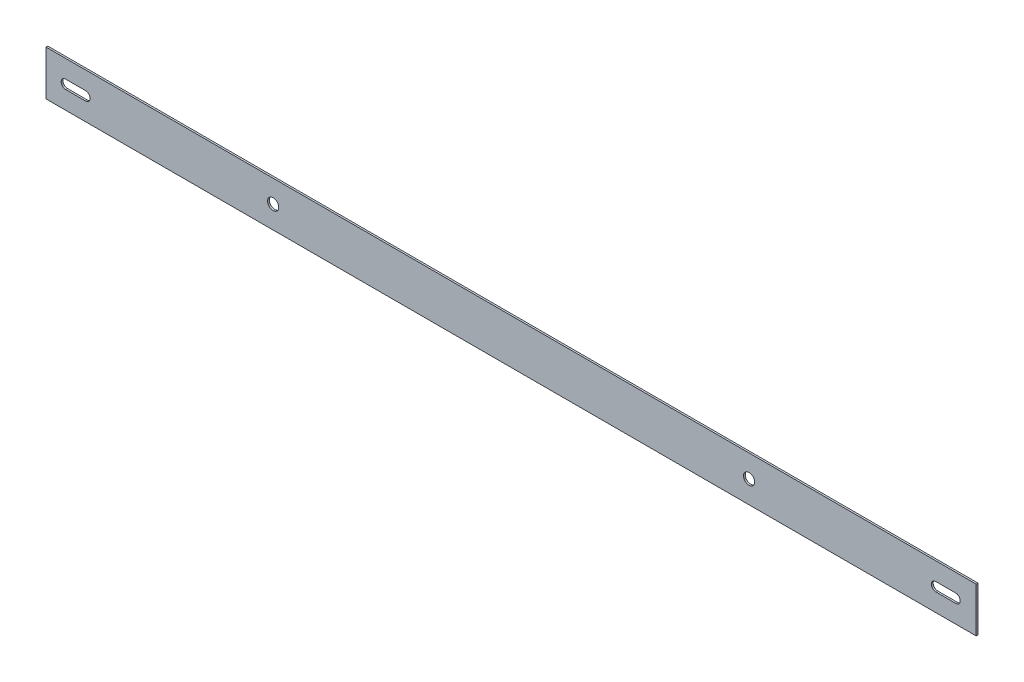
ISO-10303-21;
HEADER;
FILE_DESCRIPTION(('STEP AP214'),'2;1');
FILE_NAME('part.step','',(''),(''),'','','');
FILE_SCHEMA(('AUTOMOTIVE_DESIGN { 1 0 10303 214 1 1 1 1 }'));
ENDSEC;
DATA;
#1=APPLICATION_CONTEXT('core data for automotive mechanical design processes');
#2=APPLICATION_PROTOCOL_DEFINITION('international standard','automotive_design',2000,#1);
#3=PRODUCT_CONTEXT('',#1,'mechanical');
#4=PRODUCT('Part','Part','',(#3));
#5=PRODUCT_RELATED_PRODUCT_CATEGORY('part','',(#4));
#6=PRODUCT_DEFINITION_FORMATION('','',#4);
#7=PRODUCT_DEFINITION_CONTEXT('part definition',#1,'design');
#8=PRODUCT_DEFINITION('design','',#6,#7);
#9=PRODUCT_DEFINITION_SHAPE('','',#8);
#10=(LENGTH_UNIT() NAMED_UNIT(*) SI_UNIT(.MILLI.,.METRE.));
#11=(NAMED_UNIT(*) PLANE_ANGLE_UNIT() SI_UNIT($,.RADIAN.));
#12=(NAMED_UNIT(*) SI_UNIT($,.STERADIAN.) SOLID_ANGLE_UNIT());
#13=UNCERTAINTY_MEASURE_WITH_UNIT(LENGTH_MEASURE(1.E-05),#10,'distance_accuracy_value','');
#14=(GEOMETRIC_REPRESENTATION_CONTEXT(3) GLOBAL_UNCERTAINTY_ASSIGNED_CONTEXT((#13)) GLOBAL_UNIT_ASSIGNED_CONTEXT((#10,
#11,#12)) REPRESENTATION_CONTEXT('',''));
#15=CARTESIAN_POINT('',(0.,0.,0.));
#16=DIRECTION('',(0.,0.,1.));
#17=DIRECTION('',(1.,0.,0.));
#18=AXIS2_PLACEMENT_3D('',#15,#16,#17);
#19=CARTESIAN_POINT('',(-98.,0.,-1.7366));
#20=DIRECTION('',(0.,-1.,0.));
#21=DIRECTION('',(0.,0.,-1.));
#22=AXIS2_PLACEMENT_3D('',#19,#20,#21);
#23=PLANE('',#22);
#24=DIRECTION('',(-1.,0.,0.));
#25=VECTOR('',#24,1.);
#26=CARTESIAN_POINT('',(-99.,0.,0.));
#27=LINE('',#26,#25);
#28=CARTESIAN_POINT('',(258.90399342147,0.,-2.4980018054066E-13));
#29=VERTEX_POINT('',#28);
#30=CARTESIAN_POINT('',(-258.90399342147,0.,-1.38777878078145E-13));
#31=VERTEX_POINT('',#30);
#32=EDGE_CURVE('E71',#29,#31,#27,.T.);
#33=ORIENTED_EDGE('',*,*,#32,.T.);
#34=DIRECTION('',(0.,0.,-1.));
#35=VECTOR('',#34,1.);
#36=CARTESIAN_POINT('',(-258.90399342147,0.,-1.38777878078145E-13));
#37=LINE('',#36,#35);
#38=CARTESIAN_POINT('',(-258.90399342147,0.,-1.00000000000014));
#39=VERTEX_POINT('',#38);
#40=EDGE_CURVE('E265',#31,#39,#37,.T.);
#41=ORIENTED_EDGE('',*,*,#40,.T.);
#42=DIRECTION('',(1.,0.,0.));
#43=VECTOR('',#42,1.);
#44=CARTESIAN_POINT('',(-99.,0.,-1.));
#45=LINE('',#44,#43);
#46=CARTESIAN_POINT('',(258.90399342147,0.,-1.00000000000028));
#47=VERTEX_POINT('',#46);
#48=EDGE_CURVE('E56',#47,#39,#45,.F.);
#49=ORIENTED_EDGE('',*,*,#48,.F.);
#50=DIRECTION('',(0.,0.,1.));
#51=VECTOR('',#50,1.);
#52=CARTESIAN_POINT('',(258.90399342147,0.,-1.00000000000028));
#53=LINE('',#52,#51);
#54=EDGE_CURVE('E221',#47,#29,#53,.T.);
#55=ORIENTED_EDGE('',*,*,#54,.T.);
#56=EDGE_LOOP('',(#33,#41,#49,#55));
#57=FACE_BOUND('',#56,.T.);
#58=ADVANCED_FACE('F52',(#57),#23,.T.);
#59=CARTESIAN_POINT('',(98.,25.,-1.7366));
#60=DIRECTION('',(0.,1.,0.));
#61=DIRECTION('',(0.,0.,1.));
#62=AXIS2_PLACEMENT_3D('',#59,#60,#61);
#63=PLANE('',#62);
#64=DIRECTION('',(-1.,0.,0.));
#65=VECTOR('',#64,1.);
#66=CARTESIAN_POINT('',(-99.,25.,0.));
#67=LINE('',#66,#65);
#68=CARTESIAN_POINT('',(258.90399342147,25.,-2.4980018054066E-13));
#69=VERTEX_POINT('',#68);
#70=CARTESIAN_POINT('',(-258.90399342147,25.,-1.38777878078145E-13));
#71=VERTEX_POINT('',#70);
#72=EDGE_CURVE('E62',#69,#71,#67,.T.);
#73=ORIENTED_EDGE('',*,*,#72,.F.);
#74=DIRECTION('',(0.,0.,1.));
#75=VECTOR('',#74,1.);
#76=CARTESIAN_POINT('',(258.90399342147,25.,-1.00000000000028));
#77=LINE('',#76,#75);
#78=CARTESIAN_POINT('',(258.90399342147,25.,-1.00000000000028));
#79=VERTEX_POINT('',#78);
#80=EDGE_CURVE('E199',#79,#69,#77,.T.);
#81=ORIENTED_EDGE('',*,*,#80,.F.);
#82=DIRECTION('',(1.,0.,0.));
#83=VECTOR('',#82,1.);
#84=CARTESIAN_POINT('',(-99.,25.,-1.));
#85=LINE('',#84,#83);
#86=CARTESIAN_POINT('',(-258.90399342147,25.,-1.00000000000014));
#87=VERTEX_POINT('',#86);
#88=EDGE_CURVE('E13',#79,#87,#85,.F.);
#89=ORIENTED_EDGE('',*,*,#88,.T.);
#90=DIRECTION('',(0.,0.,-1.));
#91=VECTOR('',#90,1.);
#92=CARTESIAN_POINT('',(-258.90399342147,25.,-1.38777878078145E-13));
#93=LINE('',#92,#91);
#94=EDGE_CURVE('E181',#71,#87,#93,.T.);
#95=ORIENTED_EDGE('',*,*,#94,.F.);
#96=EDGE_LOOP('',(#73,#81,#89,#95));
#97=FACE_BOUND('',#96,.T.);
#98=ADVANCED_FACE('F297',(#97),#63,.T.);
#99=CARTESIAN_POINT('',(-99.,25.,0.));
#100=DIRECTION('',(0.,0.,1.));
#101=DIRECTION('',(1.,0.,0.));
#102=AXIS2_PLACEMENT_3D('',#99,#100,#101);
#103=PLANE('',#102);
#104=ORIENTED_EDGE('',*,*,#32,.F.);
#105=DIRECTION('',(0.,-1.,0.));
#106=VECTOR('',#105,1.);
#107=CARTESIAN_POINT('',(258.90399342147,25.,-2.4980018054066E-13));
#108=LINE('',#107,#106);
#109=EDGE_CURVE('E222',#69,#29,#108,.T.);
#110=ORIENTED_EDGE('',*,*,#109,.F.);
#111=ORIENTED_EDGE('',*,*,#72,.T.);
#112=DIRECTION('',(0.,-1.,0.));
#113=VECTOR('',#112,1.);
#114=CARTESIAN_POINT('',(-258.90399342147,25.,-1.38777878078145E-13));
#115=LINE('',#114,#113);
#116=EDGE_CURVE('E245',#71,#31,#115,.T.);
#117=ORIENTED_EDGE('',*,*,#116,.T.);
#118=EDGE_LOOP('',(#104,#110,#111,#117));
#119=FACE_BOUND('',#118,.T.);
#120=CARTESIAN_POINT('',(-247.947003759829,12.5,0.));
#121=DIRECTION('',(0.,0.,1.));
#122=DIRECTION('',(1.,0.,0.));
#123=AXIS2_PLACEMENT_3D('',#120,#121,#122);
#124=CIRCLE('',#123,2.5);
#125=CARTESIAN_POINT('',(-247.947003759829,15.,0.));
#126=VERTEX_POINT('',#125);
#127=CARTESIAN_POINT('',(-247.947003759829,10.,0.));
#128=VERTEX_POINT('',#127);
#129=EDGE_CURVE('E270',#126,#128,#124,.T.);
#130=ORIENTED_EDGE('',*,*,#129,.F.);
#131=DIRECTION('',(1.,0.,0.));
#132=VECTOR('',#131,1.);
#133=CARTESIAN_POINT('',(-242.421237076163,15.,0.));
#134=LINE('',#133,#132);
#135=CARTESIAN_POINT('',(-236.895470392496,15.,0.));
#136=VERTEX_POINT('',#135);
#137=EDGE_CURVE('E588',#136,#126,#134,.F.);
#138=ORIENTED_EDGE('',*,*,#137,.F.);
#139=CARTESIAN_POINT('',(-236.895470392496,12.5,1.2490009027033E-13));
#140=DIRECTION('',(0.,0.,1.));
#141=DIRECTION('',(1.,0.,0.));
#142=AXIS2_PLACEMENT_3D('',#139,#140,#141);
#143=CIRCLE('',#142,2.5);
#144=CARTESIAN_POINT('',(-236.895470392496,10.,1.2490009027033E-13));
#145=VERTEX_POINT('',#144);
#146=EDGE_CURVE('E279',#145,#136,#143,.T.);
#147=ORIENTED_EDGE('',*,*,#146,.F.);
#148=DIRECTION('',(1.,0.,0.));
#149=VECTOR('',#148,1.);
#150=CARTESIAN_POINT('',(-242.421237076163,10.,0.));
#151=LINE('',#150,#149);
#152=EDGE_CURVE('E287',#128,#145,#151,.T.);
#153=ORIENTED_EDGE('',*,*,#152,.F.);
#154=EDGE_LOOP('',(#130,#138,#147,#153));
#155=FACE_BOUND('',#154,.T.);
#156=CARTESIAN_POINT('',(-132.469246737715,12.5,0.));
#157=DIRECTION('',(0.,0.,1.));
#158=DIRECTION('',(1.,0.,0.));
#159=AXIS2_PLACEMENT_3D('',#156,#157,#158);
#160=CIRCLE('',#159,3.1);
#161=CARTESIAN_POINT('',(-129.369246737715,12.5,0.));
#162=VERTEX_POINT('',#161);
#163=EDGE_CURVE('E240',#162,#162,#160,.T.);
#164=ORIENTED_EDGE('',*,*,#163,.F.);
#165=EDGE_LOOP('',(#164));
#166=FACE_BOUND('',#165,.T.);
#167=CARTESIAN_POINT('',(132.469246737715,12.5,0.));
#168=DIRECTION('',(0.,0.,1.));
#169=DIRECTION('',(1.,0.,0.));
#170=AXIS2_PLACEMENT_3D('',#167,#168,#169);
#171=CIRCLE('',#170,3.1);
#172=CARTESIAN_POINT('',(129.369246737715,12.5,0.));
#173=VERTEX_POINT('',#172);
#174=EDGE_CURVE('E182',#173,#173,#171,.T.);
#175=ORIENTED_EDGE('',*,*,#174,.F.);
#176=EDGE_LOOP('',(#175));
#177=FACE_BOUND('',#176,.T.);
#178=DIRECTION('',(1.,0.,0.));
#179=VECTOR('',#178,1.);
#180=CARTESIAN_POINT('',(258.90399342147,9.99999999999999,-2.4980018054066E-13));
#181=LINE('',#180,#179);
#182=CARTESIAN_POINT('',(236.447274908041,10.,0.));
#183=VERTEX_POINT('',#182);
#184=CARTESIAN_POINT('',(247.498876046859,9.99999999999999,0.));
#185=VERTEX_POINT('',#184);
#186=EDGE_CURVE('E194',#183,#185,#181,.T.);
#187=ORIENTED_EDGE('',*,*,#186,.F.);
#188=CARTESIAN_POINT('',(236.447274908041,12.5,0.));
#189=DIRECTION('',(0.,0.,1.));
#190=DIRECTION('',(1.,0.,0.));
#191=AXIS2_PLACEMENT_3D('',#188,#189,#190);
#192=ELLIPSE('',#191,2.50001533078762,2.5);
#193=CARTESIAN_POINT('',(236.447274908041,15.,0.));
#194=VERTEX_POINT('',#193);
#195=EDGE_CURVE('E168',#194,#183,#192,.T.);
#196=ORIENTED_EDGE('',*,*,#195,.F.);
#197=DIRECTION('',(1.,0.,0.));
#198=VECTOR('',#197,1.);
#199=CARTESIAN_POINT('',(258.90399342147,15.,-2.4980018054066E-13));
#200=LINE('',#199,#198);
#201=CARTESIAN_POINT('',(247.498876046859,15.,0.));
#202=VERTEX_POINT('',#201);
#203=EDGE_CURVE('E163',#202,#194,#200,.F.);
#204=ORIENTED_EDGE('',*,*,#203,.F.);
#205=CARTESIAN_POINT('',(247.498876046859,12.5,0.));
#206=DIRECTION('',(0.,0.,1.));
#207=DIRECTION('',(1.,0.,0.));
#208=AXIS2_PLACEMENT_3D('',#205,#206,#207);
#209=ELLIPSE('',#208,2.50001533078761,2.5);
#210=EDGE_CURVE('E152',#185,#202,#209,.T.);
#211=ORIENTED_EDGE('',*,*,#210,.F.);
#212=EDGE_LOOP('',(#187,#196,#204,#211));
#213=FACE_BOUND('',#212,.T.);
#214=ADVANCED_FACE('F54',(#119,#155,#166,#177,#213),#103,.T.);
#215=CARTESIAN_POINT('',(-99.,25.,-1.));
#216=DIRECTION('',(0.,0.,1.));
#217=DIRECTION('',(1.,0.,0.));
#218=AXIS2_PLACEMENT_3D('',#215,#216,#217);
#219=PLANE('',#218);
#220=ORIENTED_EDGE('',*,*,#48,.T.);
#221=DIRECTION('',(0.,-1.,0.));
#222=VECTOR('',#221,1.);
#223=CARTESIAN_POINT('',(-258.90399342147,25.,-1.00000000000014));
#224=LINE('',#223,#222);
#225=EDGE_CURVE('E290',#87,#39,#224,.T.);
#226=ORIENTED_EDGE('',*,*,#225,.F.);
#227=ORIENTED_EDGE('',*,*,#88,.F.);
#228=DIRECTION('',(0.,-1.,0.));
#229=VECTOR('',#228,1.);
#230=CARTESIAN_POINT('',(258.90399342147,25.,-1.00000000000028));
#231=LINE('',#230,#229);
#232=EDGE_CURVE('E216',#79,#47,#231,.T.);
#233=ORIENTED_EDGE('',*,*,#232,.T.);
#234=EDGE_LOOP('',(#220,#226,#227,#233));
#235=FACE_BOUND('',#234,.T.);
#236=CARTESIAN_POINT('',(-132.469246737715,12.5,-0.999999999999945));
#237=DIRECTION('',(0.,0.,1.));
#238=DIRECTION('',(1.,0.,0.));
#239=AXIS2_PLACEMENT_3D('',#236,#237,#238);
#240=CIRCLE('',#239,3.1);
#241=CARTESIAN_POINT('',(-129.369246737715,12.5,-0.999999999999973));
#242=VERTEX_POINT('',#241);
#243=EDGE_CURVE('E187',#242,#242,#240,.T.);
#244=ORIENTED_EDGE('',*,*,#243,.T.);
#245=EDGE_LOOP('',(#244));
#246=FACE_BOUND('',#245,.T.);
#247=DIRECTION('',(-1.,0.,0.));
#248=VECTOR('',#247,1.);
#249=CARTESIAN_POINT('',(-247.947003759829,15.,-1.00000000000001));
#250=LINE('',#249,#248);
#251=CARTESIAN_POINT('',(-236.895470392496,15.,-0.999999999999876));
#252=VERTEX_POINT('',#251);
#253=CARTESIAN_POINT('',(-247.947003759829,15.,-1.00000000000001));
#254=VERTEX_POINT('',#253);
#255=EDGE_CURVE('E262',#252,#254,#250,.T.);
#256=ORIENTED_EDGE('',*,*,#255,.T.);
#257=CARTESIAN_POINT('',(-247.947003759829,12.5,-1.00000000000001));
#258=DIRECTION('',(0.,0.,1.));
#259=DIRECTION('',(-1.,0.,0.));
#260=AXIS2_PLACEMENT_3D('',#257,#258,#259);
#261=CIRCLE('',#260,2.5);
#262=CARTESIAN_POINT('',(-247.947003759829,10.,-1.00000000000001));
#263=VERTEX_POINT('',#262);
#264=EDGE_CURVE('E259',#254,#263,#261,.T.);
#265=ORIENTED_EDGE('',*,*,#264,.T.);
#266=DIRECTION('',(1.,0.,0.));
#267=VECTOR('',#266,1.);
#268=CARTESIAN_POINT('',(-247.947003759829,10.,-0.999999999999987));
#269=LINE('',#268,#267);
#270=CARTESIAN_POINT('',(-236.895470392496,10.,-0.999999999999876));
#271=VERTEX_POINT('',#270);
#272=EDGE_CURVE('E256',#263,#271,#269,.T.);
#273=ORIENTED_EDGE('',*,*,#272,.T.);
#274=CARTESIAN_POINT('',(-236.895470392496,12.5,-0.999999999999876));
#275=DIRECTION('',(0.,0.,1.));
#276=DIRECTION('',(-1.,0.,0.));
#277=AXIS2_PLACEMENT_3D('',#274,#275,#276);
#278=CIRCLE('',#277,2.5);
#279=EDGE_CURVE('E250',#271,#252,#278,.T.);
#280=ORIENTED_EDGE('',*,*,#279,.T.);
#281=EDGE_LOOP('',(#256,#265,#273,#280));
#282=FACE_BOUND('',#281,.T.);
#283=CARTESIAN_POINT('',(132.469246737715,12.5,-0.999999999999959));
#284=DIRECTION('',(0.,0.,1.));
#285=DIRECTION('',(1.,0.,0.));
#286=AXIS2_PLACEMENT_3D('',#283,#284,#285);
#287=CIRCLE('',#286,3.1);
#288=CARTESIAN_POINT('',(129.369246737715,12.5,-0.999999999999959));
#289=VERTEX_POINT('',#288);
#290=EDGE_CURVE('E178',#289,#289,#287,.T.);
#291=ORIENTED_EDGE('',*,*,#290,.T.);
#292=EDGE_LOOP('',(#291));
#293=FACE_BOUND('',#292,.T.);
#294=CARTESIAN_POINT('',(236.447274908041,12.5,-0.999999999999945));
#295=DIRECTION('',(0.,0.,1.));
#296=DIRECTION('',(1.,0.,0.));
#297=AXIS2_PLACEMENT_3D('',#294,#295,#296);
#298=ELLIPSE('',#297,2.50001533078762,2.5);
#299=CARTESIAN_POINT('',(236.447274908041,15.,-0.999999999999945));
#300=VERTEX_POINT('',#299);
#301=CARTESIAN_POINT('',(236.447274908041,10.,-0.999999999999945));
#302=VERTEX_POINT('',#301);
#303=EDGE_CURVE('E213',#300,#302,#298,.T.);
#304=ORIENTED_EDGE('',*,*,#303,.T.);
#305=DIRECTION('',(1.,0.,0.));
#306=VECTOR('',#305,1.);
#307=CARTESIAN_POINT('',(258.90399342147,10.,-1.00000000000028));
#308=LINE('',#307,#306);
#309=CARTESIAN_POINT('',(247.498876046859,10.,-1.00000000000011));
#310=VERTEX_POINT('',#309);
#311=EDGE_CURVE('E210',#302,#310,#308,.T.);
#312=ORIENTED_EDGE('',*,*,#311,.T.);
#313=CARTESIAN_POINT('',(247.498876046859,12.5,-1.00000000000011));
#314=DIRECTION('',(0.,0.,1.));
#315=DIRECTION('',(1.,0.,0.));
#316=AXIS2_PLACEMENT_3D('',#313,#314,#315);
#317=ELLIPSE('',#316,2.50001533078761,2.5);
#318=CARTESIAN_POINT('',(247.498876046859,15.,-1.00000000000011));
#319=VERTEX_POINT('',#318);
#320=EDGE_CURVE('E212',#310,#319,#317,.T.);
#321=ORIENTED_EDGE('',*,*,#320,.T.);
#322=DIRECTION('',(-1.,0.,0.));
#323=VECTOR('',#322,1.);
#324=CARTESIAN_POINT('',(258.90399342147,15.,-1.00000000000028));
#325=LINE('',#324,#323);
#326=EDGE_CURVE('E146',#319,#300,#325,.T.);
#327=ORIENTED_EDGE('',*,*,#326,.T.);
#328=EDGE_LOOP('',(#304,#312,#321,#327));
#329=FACE_BOUND('',#328,.T.);
#330=ADVANCED_FACE('F301',(#235,#246,#282,#293,#329),#219,.F.);
#331=CARTESIAN_POINT('',(-258.90399342147,25.,-1.38777878078145E-13));
#332=DIRECTION('',(-1.,0.,0.));
#333=DIRECTION('',(0.,0.,1.));
#334=AXIS2_PLACEMENT_3D('',#331,#332,#333);
#335=PLANE('',#334);
#336=ORIENTED_EDGE('',*,*,#40,.F.);
#337=ORIENTED_EDGE('',*,*,#116,.F.);
#338=ORIENTED_EDGE('',*,*,#94,.T.);
#339=ORIENTED_EDGE('',*,*,#225,.T.);
#340=EDGE_LOOP('',(#336,#337,#338,#339));
#341=FACE_BOUND('',#340,.T.);
#342=ADVANCED_FACE('F295',(#341),#335,.T.);
#343=CARTESIAN_POINT('',(-247.947003759829,10.,-0.999999999999987));
#344=DIRECTION('',(0.,-1.,0.));
#345=DIRECTION('',(1.,0.,0.));
#346=AXIS2_PLACEMENT_3D('',#343,#344,#345);
#347=PLANE('',#346);
#348=DIRECTION('',(0.,0.,1.));
#349=VECTOR('',#348,1.);
#350=CARTESIAN_POINT('',(-247.947003759829,10.,-1.00000000000001));
#351=LINE('',#350,#349);
#352=EDGE_CURVE('E267',#128,#263,#351,.F.);
#353=ORIENTED_EDGE('',*,*,#352,.F.);
#354=ORIENTED_EDGE('',*,*,#152,.T.);
#355=DIRECTION('',(0.,0.,1.));
#356=VECTOR('',#355,1.);
#357=CARTESIAN_POINT('',(-236.895470392496,10.,-0.999999999999876));
#358=LINE('',#357,#356);
#359=EDGE_CURVE('E285',#145,#271,#358,.F.);
#360=ORIENTED_EDGE('',*,*,#359,.T.);
#361=ORIENTED_EDGE('',*,*,#272,.F.);
#362=EDGE_LOOP('',(#353,#354,#360,#361));
#363=FACE_BOUND('',#362,.T.);
#364=ADVANCED_FACE('F330',(#363),#347,.F.);
#365=CARTESIAN_POINT('',(-236.895470392496,12.5,-0.999999999999876));
#366=DIRECTION('',(0.,0.,1.));
#367=DIRECTION('',(1.,0.,0.));
#368=AXIS2_PLACEMENT_3D('',#365,#366,#367);
#369=CYLINDRICAL_SURFACE('',#368,2.5);
#370=ORIENTED_EDGE('',*,*,#146,.T.);
#371=DIRECTION('',(0.,0.,1.));
#372=VECTOR('',#371,1.);
#373=CARTESIAN_POINT('',(-236.895470392496,15.,-0.999999999999904));
#374=LINE('',#373,#372);
#375=EDGE_CURVE('E284',#136,#252,#374,.F.);
#376=ORIENTED_EDGE('',*,*,#375,.T.);
#377=ORIENTED_EDGE('',*,*,#279,.F.);
#378=ORIENTED_EDGE('',*,*,#359,.F.);
#379=EDGE_LOOP('',(#370,#376,#377,#378));
#380=FACE_BOUND('',#379,.T.);
#381=ADVANCED_FACE('F333',(#380),#369,.F.);
#382=CARTESIAN_POINT('',(-247.947003759829,15.,-1.00000000000001));
#383=DIRECTION('',(0.,1.,0.));
#384=DIRECTION('',(-1.,0.,0.));
#385=AXIS2_PLACEMENT_3D('',#382,#383,#384);
#386=PLANE('',#385);
#387=ORIENTED_EDGE('',*,*,#375,.F.);
#388=ORIENTED_EDGE('',*,*,#137,.T.);
#389=DIRECTION('',(0.,0.,1.));
#390=VECTOR('',#389,1.);
#391=CARTESIAN_POINT('',(-247.947003759829,15.,-1.00000000000001));
#392=LINE('',#391,#390);
#393=EDGE_CURVE('E274',#126,#254,#392,.F.);
#394=ORIENTED_EDGE('',*,*,#393,.T.);
#395=ORIENTED_EDGE('',*,*,#255,.F.);
#396=EDGE_LOOP('',(#387,#388,#394,#395));
#397=FACE_BOUND('',#396,.T.);
#398=ADVANCED_FACE('F337',(#397),#386,.F.);
#399=CARTESIAN_POINT('',(-247.947003759829,12.5,-1.00000000000001));
#400=DIRECTION('',(0.,0.,1.));
#401=DIRECTION('',(1.,0.,0.));
#402=AXIS2_PLACEMENT_3D('',#399,#400,#401);
#403=CYLINDRICAL_SURFACE('',#402,2.5);
#404=ORIENTED_EDGE('',*,*,#393,.F.);
#405=ORIENTED_EDGE('',*,*,#129,.T.);
#406=ORIENTED_EDGE('',*,*,#352,.T.);
#407=ORIENTED_EDGE('',*,*,#264,.F.);
#408=EDGE_LOOP('',(#404,#405,#406,#407));
#409=FACE_BOUND('',#408,.T.);
#410=ADVANCED_FACE('F341',(#409),#403,.F.);
#411=CARTESIAN_POINT('',(-132.469246737715,12.5,-231.967615470496));
#412=DIRECTION('',(0.,0.,1.));
#413=DIRECTION('',(1.,0.,0.));
#414=AXIS2_PLACEMENT_3D('',#411,#412,#413);
#415=CYLINDRICAL_SURFACE('',#414,3.1);
#416=CARTESIAN_POINT('',(-129.369246737715,12.5,0.));
#417=CARTESIAN_POINT('',(-129.369246737715,12.5,-0.0104166666666424));
#418=CARTESIAN_POINT('',(-129.369246737715,12.5,-0.0208333333333125));
#419=CARTESIAN_POINT('',(-129.369246737715,12.5,-0.0416666666666436));
#420=CARTESIAN_POINT('',(-129.369246737715,12.5,-0.0520833333333045));
#421=CARTESIAN_POINT('',(-129.369246737715,12.5,-0.0729166666666355));
#422=CARTESIAN_POINT('',(-129.369246737715,12.5,-0.0833333333333057));
#423=CARTESIAN_POINT('',(-129.369246737715,12.5,-0.104166666666637));
#424=CARTESIAN_POINT('',(-129.369246737715,12.5,-0.114583333333298));
#425=CARTESIAN_POINT('',(-129.369246737715,12.5,-0.135416666666629));
#426=CARTESIAN_POINT('',(-129.369246737715,12.5,-0.145833333333299));
#427=CARTESIAN_POINT('',(-129.369246737715,12.5,-0.166666666666639));
#428=CARTESIAN_POINT('',(-129.369246737715,12.5,-0.177083333333309));
#429=CARTESIAN_POINT('',(-129.369246737715,12.5,-0.19791666666664));
#430=CARTESIAN_POINT('',(-129.369246737715,12.5,-0.208333333333301));
#431=CARTESIAN_POINT('',(-129.369246737715,12.5,-0.229166666666632));
#432=CARTESIAN_POINT('',(-129.369246737715,12.5,-0.239583333333302));
#433=CARTESIAN_POINT('',(-129.369246737715,12.5,-0.260416666666643));
#434=CARTESIAN_POINT('',(-129.369246737715,12.5,-0.270833333333313));
#435=CARTESIAN_POINT('',(-129.369246737715,12.5,-0.291666666666644));
#436=CARTESIAN_POINT('',(-129.369246737715,12.5,-0.302083333333305));
#437=CARTESIAN_POINT('',(-129.369246737715,12.5,-0.322916666666636));
#438=CARTESIAN_POINT('',(-129.369246737715,12.5,-0.333333333333306));
#439=CARTESIAN_POINT('',(-129.369246737715,12.5,-0.354166666666646));
#440=CARTESIAN_POINT('',(-129.369246737715,12.5,-0.364583333333316));
#441=CARTESIAN_POINT('',(-129.369246737715,12.5,-0.385416666666647));
#442=CARTESIAN_POINT('',(-129.369246737715,12.5,-0.395833333333308));
#443=CARTESIAN_POINT('',(-129.369246737715,12.5,-0.416666666666639));
#444=CARTESIAN_POINT('',(-129.369246737715,12.5,-0.427083333333309));
#445=CARTESIAN_POINT('',(-129.369246737715,12.5,-0.44791666666664));
#446=CARTESIAN_POINT('',(-129.369246737715,12.5,-0.458333333333301));
#447=CARTESIAN_POINT('',(-129.369246737715,12.5,-0.479166666666632));
#448=CARTESIAN_POINT('',(-129.369246737715,12.5,-0.489583333333303));
#449=CARTESIAN_POINT('',(-129.369246737715,12.5,-0.510416666666643));
#450=CARTESIAN_POINT('',(-129.369246737715,12.5,-0.520833333333313));
#451=CARTESIAN_POINT('',(-129.369246737715,12.5,-0.541666666666644));
#452=CARTESIAN_POINT('',(-129.369246737715,12.5,-0.552083333333305));
#453=CARTESIAN_POINT('',(-129.369246737715,12.5,-0.572916666666636));
#454=CARTESIAN_POINT('',(-129.369246737715,12.5,-0.583333333333306));
#455=CARTESIAN_POINT('',(-129.369246737715,12.5,-0.604166666666637));
#456=CARTESIAN_POINT('',(-129.369246737715,12.5,-0.614583333333298));
#457=CARTESIAN_POINT('',(-129.369246737715,12.5,-0.635416666666629));
#458=CARTESIAN_POINT('',(-129.369246737715,12.5,-0.645833333333299));
#459=CARTESIAN_POINT('',(-129.369246737715,12.5,-0.66666666666664));
#460=CARTESIAN_POINT('',(-129.369246737715,12.5,-0.67708333333331));
#461=CARTESIAN_POINT('',(-129.369246737715,12.5,-0.697916666666641));
#462=CARTESIAN_POINT('',(-129.369246737715,12.5,-0.708333333333302));
#463=CARTESIAN_POINT('',(-129.369246737715,12.5,-0.729166666666633));
#464=CARTESIAN_POINT('',(-129.369246737715,12.5,-0.739583333333303));
#465=CARTESIAN_POINT('',(-129.369246737715,12.5,-0.760416666666643));
#466=CARTESIAN_POINT('',(-129.369246737715,12.5,-0.770833333333313));
#467=CARTESIAN_POINT('',(-129.369246737715,12.5,-0.791666666666644));
#468=CARTESIAN_POINT('',(-129.369246737715,12.5,-0.802083333333305));
#469=CARTESIAN_POINT('',(-129.369246737715,12.5,-0.822916666666636));
#470=CARTESIAN_POINT('',(-129.369246737715,12.5,-0.833333333333306));
#471=CARTESIAN_POINT('',(-129.369246737715,12.5,-0.854166666666647));
#472=CARTESIAN_POINT('',(-129.369246737715,12.5,-0.864583333333317));
#473=CARTESIAN_POINT('',(-129.369246737715,12.5,-0.885416666666648));
#474=CARTESIAN_POINT('',(-129.369246737715,12.5,-0.895833333333309));
#475=CARTESIAN_POINT('',(-129.369246737715,12.5,-0.91666666666664));
#476=CARTESIAN_POINT('',(-129.369246737715,12.5,-0.92708333333331));
#477=CARTESIAN_POINT('',(-129.369246737715,12.5,-0.947916666666641));
#478=CARTESIAN_POINT('',(-129.369246737715,12.5,-0.958333333333302));
#479=CARTESIAN_POINT('',(-129.369246737715,12.5,-0.979166666666633));
#480=CARTESIAN_POINT('',(-129.369246737715,12.5,-0.989583333333303));
#481=CARTESIAN_POINT('',(-129.369246737715,12.5,-0.999999999999973));
#482=B_SPLINE_CURVE_WITH_KNOTS('',3,(#416,#417,#418,#419,#420,#421,#422,#423,#424,#425,#426,
#427,#428,#429,#430,#431,#432,#433,#434,#435,#436,#437,#438,#439,#440,#441,#442,#443,#444,#445,
#446,#447,#448,#449,#450,#451,#452,#453,#454,#455,#456,#457,#458,#459,#460,#461,#462,#463,#464,
#465,#466,#467,#468,#469,#470,#471,#472,#473,#474,#475,#476,#477,#478,#479,#480,#481),
.UNSPECIFIED.,.F.,.F.,(4,2,2,2,2,2,2,2,2,2,2,2,2,2,2,2,2,2,2,2,2,2,2,2,2,2,2,2,2,2,2,2,4),(0.,
0.0312500000000104,0.0624999999999931,0.0937500000000036,0.124999999999986,0.156249999999997,
0.187500000000007,0.21874999999999,0.25,0.281250000000011,0.312499999999993,0.343750000000004,
0.375000000000014,0.406249999999997,0.437500000000007,0.46874999999999,0.5,0.531250000000011,
0.562499999999994,0.593750000000004,0.624999999999987,0.656249999999997,0.687500000000008,
0.71874999999999,0.750000000000001,0.781250000000011,0.812499999999994,0.843750000000004,
0.875000000000015,0.906249999999997,0.937500000000008,0.96874999999999,1.),.UNSPECIFIED.);
#483=EDGE_CURVE('BSEAM326',#162,#242,#482,.T.);
#484=ORIENTED_EDGE('',*,*,#163,.T.);
#485=ORIENTED_EDGE('',*,*,#243,.F.);
#486=ORIENTED_EDGE('',*,*,#483,.T.);
#487=ORIENTED_EDGE('',*,*,#483,.F.);
#488=EDGE_LOOP('',(#484,#486,#485,#487));
#489=FACE_BOUND('',#488,.T.);
#490=ADVANCED_FACE('F326',(#489),#415,.F.);
#491=CARTESIAN_POINT('',(132.469246737715,12.5,33.9676154704962));
#492=DIRECTION('',(0.,0.,-1.));
#493=DIRECTION('',(-1.,0.,0.));
#494=AXIS2_PLACEMENT_3D('',#491,#492,#493);
#495=CYLINDRICAL_SURFACE('',#494,3.1);
#496=CARTESIAN_POINT('',(129.369246737715,12.5,0.));
#497=CARTESIAN_POINT('',(129.369246737715,12.5,-0.0104166666666239));
#498=CARTESIAN_POINT('',(129.369246737715,12.5,-0.0208333333332894));
#499=CARTESIAN_POINT('',(129.369246737715,12.5,-0.0416666666666228));
#500=CARTESIAN_POINT('',(129.369246737715,12.5,-0.0520833333332906));
#501=CARTESIAN_POINT('',(129.369246737715,12.5,-0.0729166666666263));
#502=CARTESIAN_POINT('',(129.369246737715,12.5,-0.0833333333332941));
#503=CARTESIAN_POINT('',(129.369246737715,12.5,-0.104166666666627));
#504=CARTESIAN_POINT('',(129.369246737715,12.5,-0.114583333333293));
#505=CARTESIAN_POINT('',(129.369246737715,12.5,-0.135416666666624));
#506=CARTESIAN_POINT('',(129.369246737715,12.5,-0.14583333333329));
#507=CARTESIAN_POINT('',(129.369246737715,12.5,-0.166666666666623));
#508=CARTESIAN_POINT('',(129.369246737715,12.5,-0.177083333333291));
#509=CARTESIAN_POINT('',(129.369246737715,12.5,-0.197916666666626));
#510=CARTESIAN_POINT('',(129.369246737715,12.5,-0.208333333333294));
#511=CARTESIAN_POINT('',(129.369246737715,12.5,-0.229166666666628));
#512=CARTESIAN_POINT('',(129.369246737715,12.5,-0.239583333333293));
#513=CARTESIAN_POINT('',(129.369246737715,12.5,-0.260416666666624));
#514=CARTESIAN_POINT('',(129.369246737715,12.5,-0.27083333333329));
#515=CARTESIAN_POINT('',(129.369246737715,12.5,-0.291666666666623));
#516=CARTESIAN_POINT('',(129.369246737715,12.5,-0.302083333333291));
#517=CARTESIAN_POINT('',(129.369246737715,12.5,-0.322916666666626));
#518=CARTESIAN_POINT('',(129.369246737715,12.5,-0.333333333333294));
#519=CARTESIAN_POINT('',(129.369246737715,12.5,-0.354166666666628));
#520=CARTESIAN_POINT('',(129.369246737715,12.5,-0.364583333333293));
#521=CARTESIAN_POINT('',(129.369246737715,12.5,-0.385416666666624));
#522=CARTESIAN_POINT('',(129.369246737715,12.5,-0.39583333333329));
#523=CARTESIAN_POINT('',(129.369246737715,12.5,-0.416666666666623));
#524=CARTESIAN_POINT('',(129.369246737715,12.5,-0.427083333333291));
#525=CARTESIAN_POINT('',(129.369246737715,12.5,-0.447916666666627));
#526=CARTESIAN_POINT('',(129.369246737715,12.5,-0.458333333333294));
#527=CARTESIAN_POINT('',(129.369246737715,12.5,-0.479166666666628));
#528=CARTESIAN_POINT('',(129.369246737715,12.5,-0.489583333333293));
#529=CARTESIAN_POINT('',(129.369246737715,12.5,-0.510416666666624));
#530=CARTESIAN_POINT('',(129.369246737715,12.5,-0.52083333333329));
#531=CARTESIAN_POINT('',(129.369246737715,12.5,-0.541666666666623));
#532=CARTESIAN_POINT('',(129.369246737715,12.5,-0.552083333333291));
#533=CARTESIAN_POINT('',(129.369246737715,12.5,-0.572916666666627));
#534=CARTESIAN_POINT('',(129.369246737715,12.5,-0.583333333333295));
#535=CARTESIAN_POINT('',(129.369246737715,12.5,-0.604166666666628));
#536=CARTESIAN_POINT('',(129.369246737715,12.5,-0.614583333333293));
#537=CARTESIAN_POINT('',(129.369246737715,12.5,-0.635416666666624));
#538=CARTESIAN_POINT('',(129.369246737715,12.5,-0.64583333333329));
#539=CARTESIAN_POINT('',(129.369246737715,12.5,-0.666666666666623));
#540=CARTESIAN_POINT('',(129.369246737715,12.5,-0.677083333333291));
#541=CARTESIAN_POINT('',(129.369246737715,12.5,-0.697916666666627));
#542=CARTESIAN_POINT('',(129.369246737715,12.5,-0.708333333333295));
#543=CARTESIAN_POINT('',(129.369246737715,12.5,-0.729166666666628));
#544=CARTESIAN_POINT('',(129.369246737715,12.5,-0.739583333333294));
#545=CARTESIAN_POINT('',(129.369246737715,12.5,-0.760416666666625));
#546=CARTESIAN_POINT('',(129.369246737715,12.5,-0.77083333333329));
#547=CARTESIAN_POINT('',(129.369246737715,12.5,-0.791666666666623));
#548=CARTESIAN_POINT('',(129.369246737715,12.5,-0.802083333333291));
#549=CARTESIAN_POINT('',(129.369246737715,12.5,-0.822916666666627));
#550=CARTESIAN_POINT('',(129.369246737715,12.5,-0.833333333333295));
#551=CARTESIAN_POINT('',(129.369246737715,12.5,-0.854166666666628));
#552=CARTESIAN_POINT('',(129.369246737715,12.5,-0.864583333333294));
#553=CARTESIAN_POINT('',(129.369246737715,12.5,-0.885416666666625));
#554=CARTESIAN_POINT('',(129.369246737715,12.5,-0.89583333333329));
#555=CARTESIAN_POINT('',(129.369246737715,12.5,-0.916666666666624));
#556=CARTESIAN_POINT('',(129.369246737715,12.5,-0.927083333333291));
#557=CARTESIAN_POINT('',(129.369246737715,12.5,-0.947916666666627));
#558=CARTESIAN_POINT('',(129.369246737715,12.5,-0.958333333333295));
#559=CARTESIAN_POINT('',(129.369246737715,12.5,-0.979166666666628));
#560=CARTESIAN_POINT('',(129.369246737715,12.5,-0.989583333333294));
#561=CARTESIAN_POINT('',(129.369246737715,12.5,-0.999999999999959));
#562=B_SPLINE_CURVE_WITH_KNOTS('',3,(#496,#497,#498,#499,#500,#501,#502,#503,#504,#505,#506,
#507,#508,#509,#510,#511,#512,#513,#514,#515,#516,#517,#518,#519,#520,#521,#522,#523,#524,#525,
#526,#527,#528,#529,#530,#531,#532,#533,#534,#535,#536,#537,#538,#539,#540,#541,#542,#543,#544,
#545,#546,#547,#548,#549,#550,#551,#552,#553,#554,#555,#556,#557,#558,#559,#560,#561),
.UNSPECIFIED.,.F.,.F.,(4,2,2,2,2,2,2,2,2,2,2,2,2,2,2,2,2,2,2,2,2,2,2,2,2,2,2,2,2,2,2,2,4),(0.,
0.0312499999999966,0.0625000000000001,0.0937500000000036,0.125,0.156249999999997,0.1875,
0.218750000000004,0.25,0.281249999999997,0.3125,0.343750000000004,0.375,0.406249999999997,
0.4375,0.468750000000004,0.5,0.531249999999997,0.5625,0.593750000000004,0.625000000000001,
0.656249999999997,0.687500000000001,0.718750000000004,0.750000000000001,0.781249999999997,
0.812500000000001,0.843750000000004,0.875000000000001,0.906249999999997,0.937500000000001,
0.968750000000004,1.),.UNSPECIFIED.);
#563=EDGE_CURVE('BSEAM323',#173,#289,#562,.T.);
#564=ORIENTED_EDGE('',*,*,#174,.T.);
#565=ORIENTED_EDGE('',*,*,#290,.F.);
#566=ORIENTED_EDGE('',*,*,#563,.T.);
#567=ORIENTED_EDGE('',*,*,#563,.F.);
#568=EDGE_LOOP('',(#564,#566,#565,#567));
#569=FACE_BOUND('',#568,.T.);
#570=ADVANCED_FACE('F323',(#569),#495,.F.);
#571=CARTESIAN_POINT('',(247.498876046859,12.5,-1.00000000000011));
#572=DIRECTION('',(0.,0.,1.));
#573=DIRECTION('',(1.,0.,0.));
#574=AXIS2_PLACEMENT_3D('',#571,#572,#573);
#575=ELLIPSE('',#574,2.50001533078761,2.5);
#576=DIRECTION('',(0.,0.,1.));
#577=VECTOR('',#576,1.);
#578=SURFACE_OF_LINEAR_EXTRUSION('',#575,#577);
#579=DIRECTION('',(0.,0.,-1.));
#580=VECTOR('',#579,1.);
#581=CARTESIAN_POINT('',(247.498876046859,15.,-1.00000000000011));
#582=LINE('',#581,#580);
#583=EDGE_CURVE('E155',#319,#202,#582,.F.);
#584=ORIENTED_EDGE('',*,*,#583,.F.);
#585=ORIENTED_EDGE('',*,*,#320,.F.);
#586=DIRECTION('',(0.,0.,-1.));
#587=VECTOR('',#586,1.);
#588=CARTESIAN_POINT('',(247.498876046859,10.,-1.00000000000011));
#589=LINE('',#588,#587);
#590=EDGE_CURVE('E157',#310,#185,#589,.F.);
#591=ORIENTED_EDGE('',*,*,#590,.T.);
#592=ORIENTED_EDGE('',*,*,#210,.T.);
#593=EDGE_LOOP('',(#584,#585,#591,#592));
#594=FACE_BOUND('',#593,.T.);
#595=ADVANCED_FACE('F153',(#594),#578,.F.);
#596=CARTESIAN_POINT('',(258.90399342147,15.,-1.00000000000028));
#597=DIRECTION('',(0.,1.,0.));
#598=DIRECTION('',(-1.,0.,0.));
#599=AXIS2_PLACEMENT_3D('',#596,#597,#598);
#600=PLANE('',#599);
#601=DIRECTION('',(0.,0.,-1.));
#602=VECTOR('',#601,1.);
#603=CARTESIAN_POINT('',(236.447274908041,15.,-0.999999999999945));
#604=LINE('',#603,#602);
#605=EDGE_CURVE('E170',#300,#194,#604,.F.);
#606=ORIENTED_EDGE('',*,*,#605,.F.);
#607=ORIENTED_EDGE('',*,*,#326,.F.);
#608=ORIENTED_EDGE('',*,*,#583,.T.);
#609=ORIENTED_EDGE('',*,*,#203,.T.);
#610=EDGE_LOOP('',(#606,#607,#608,#609));
#611=FACE_BOUND('',#610,.T.);
#612=ADVANCED_FACE('F162',(#611),#600,.F.);
#613=CARTESIAN_POINT('',(236.447274908041,12.5,-0.999999999999945));
#614=DIRECTION('',(0.,0.,1.));
#615=DIRECTION('',(1.,0.,0.));
#616=AXIS2_PLACEMENT_3D('',#613,#614,#615);
#617=ELLIPSE('',#616,2.50001533078762,2.5);
#618=DIRECTION('',(0.,0.,1.));
#619=VECTOR('',#618,1.);
#620=SURFACE_OF_LINEAR_EXTRUSION('',#617,#619);
#621=DIRECTION('',(0.,0.,-1.));
#622=VECTOR('',#621,1.);
#623=CARTESIAN_POINT('',(236.447274908041,10.,-0.999999999999945));
#624=LINE('',#623,#622);
#625=EDGE_CURVE('E200',#302,#183,#624,.F.);
#626=ORIENTED_EDGE('',*,*,#625,.F.);
#627=ORIENTED_EDGE('',*,*,#303,.F.);
#628=ORIENTED_EDGE('',*,*,#605,.T.);
#629=ORIENTED_EDGE('',*,*,#195,.T.);
#630=EDGE_LOOP('',(#626,#627,#628,#629));
#631=FACE_BOUND('',#630,.T.);
#632=ADVANCED_FACE('F205',(#631),#620,.F.);
#633=CARTESIAN_POINT('',(258.90399342147,10.,-1.00000000000028));
#634=DIRECTION('',(0.,-1.,0.));
#635=DIRECTION('',(1.,0.,0.));
#636=AXIS2_PLACEMENT_3D('',#633,#634,#635);
#637=PLANE('',#636);
#638=ORIENTED_EDGE('',*,*,#311,.F.);
#639=ORIENTED_EDGE('',*,*,#625,.T.);
#640=ORIENTED_EDGE('',*,*,#186,.T.);
#641=ORIENTED_EDGE('',*,*,#590,.F.);
#642=EDGE_LOOP('',(#638,#639,#640,#641));
#643=FACE_BOUND('',#642,.T.);
#644=ADVANCED_FACE('F208',(#643),#637,.F.);
#645=CARTESIAN_POINT('',(258.90399342147,25.,-1.00000000000028));
#646=DIRECTION('',(1.,0.,0.));
#647=DIRECTION('',(0.,0.,-1.));
#648=AXIS2_PLACEMENT_3D('',#645,#646,#647);
#649=PLANE('',#648);
#650=ORIENTED_EDGE('',*,*,#54,.F.);
#651=ORIENTED_EDGE('',*,*,#232,.F.);
#652=ORIENTED_EDGE('',*,*,#80,.T.);
#653=ORIENTED_EDGE('',*,*,#109,.T.);
#654=EDGE_LOOP('',(#650,#651,#652,#653));
#655=FACE_BOUND('',#654,.T.);
#656=ADVANCED_FACE('F319',(#655),#649,.T.);
#657=CLOSED_SHELL('',(#58,#98,#214,#330,#342,#364,#381,#398,#410,#490,#570,#595,#612,#632,#644,#656));
#658=MANIFOLD_SOLID_BREP('B2',#657);
#659=ADVANCED_BREP_SHAPE_REPRESENTATION('',(#18,#658),#14);
#660=SHAPE_DEFINITION_REPRESENTATION(#9,#659);
ENDSEC;
END-ISO-10303-21;
